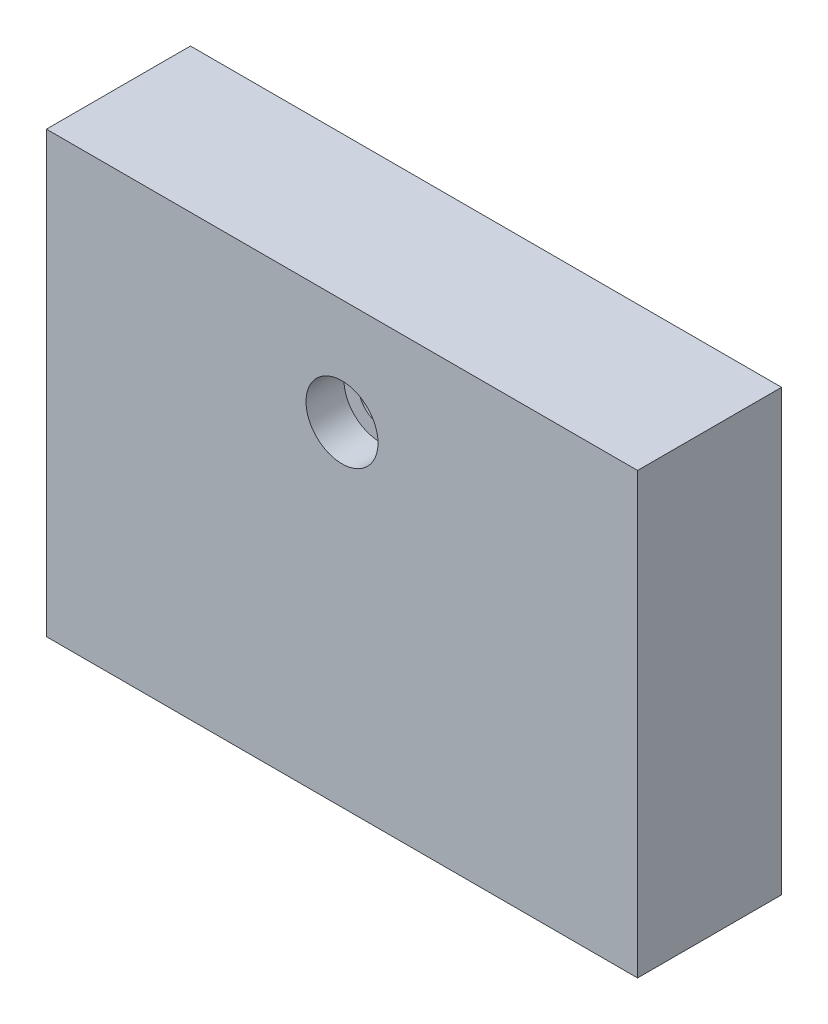
ISO-10303-21;
HEADER;
FILE_DESCRIPTION(('STEP AP214'),'2;1');
FILE_NAME('part.step','',(''),(''),'','','');
FILE_SCHEMA(('AUTOMOTIVE_DESIGN { 1 0 10303 214 1 1 1 1 }'));
ENDSEC;
DATA;
#1=APPLICATION_CONTEXT('core data for automotive mechanical design processes');
#2=APPLICATION_PROTOCOL_DEFINITION('international standard','automotive_design',2000,#1);
#3=PRODUCT_CONTEXT('',#1,'mechanical');
#4=PRODUCT('Part','Part','',(#3));
#5=PRODUCT_RELATED_PRODUCT_CATEGORY('part','',(#4));
#6=PRODUCT_DEFINITION_FORMATION('','',#4);
#7=PRODUCT_DEFINITION_CONTEXT('part definition',#1,'design');
#8=PRODUCT_DEFINITION('design','',#6,#7);
#9=PRODUCT_DEFINITION_SHAPE('','',#8);
#10=(LENGTH_UNIT() NAMED_UNIT(*) SI_UNIT(.MILLI.,.METRE.));
#11=(NAMED_UNIT(*) PLANE_ANGLE_UNIT() SI_UNIT($,.RADIAN.));
#12=(NAMED_UNIT(*) SI_UNIT($,.STERADIAN.) SOLID_ANGLE_UNIT());
#13=UNCERTAINTY_MEASURE_WITH_UNIT(LENGTH_MEASURE(1.E-05),#10,'distance_accuracy_value','');
#14=(GEOMETRIC_REPRESENTATION_CONTEXT(3) GLOBAL_UNCERTAINTY_ASSIGNED_CONTEXT((#13)) GLOBAL_UNIT_ASSIGNED_CONTEXT((#10,
#11,#12)) REPRESENTATION_CONTEXT('',''));
#15=CARTESIAN_POINT('',(0.,0.,0.));
#16=DIRECTION('',(0.,0.,1.));
#17=DIRECTION('',(1.,0.,0.));
#18=AXIS2_PLACEMENT_3D('',#15,#16,#17);
#19=CARTESIAN_POINT('',(0.,0.,19.));
#20=DIRECTION('',(1.,0.,0.));
#21=DIRECTION('',(0.,0.,-1.));
#22=AXIS2_PLACEMENT_3D('',#19,#20,#21);
#23=PLANE('',#22);
#24=DIRECTION('',(0.,-1.,0.));
#25=VECTOR('',#24,1.);
#26=CARTESIAN_POINT('',(0.,0.,0.));
#27=LINE('',#26,#25);
#28=CARTESIAN_POINT('',(0.,58.,0.));
#29=VERTEX_POINT('',#28);
#30=CARTESIAN_POINT('',(0.,0.,0.));
#31=VERTEX_POINT('',#30);
#32=EDGE_CURVE('E101',#29,#31,#27,.T.);
#33=ORIENTED_EDGE('',*,*,#32,.T.);
#34=DIRECTION('',(0.,0.,-1.));
#35=VECTOR('',#34,1.);
#36=CARTESIAN_POINT('',(0.,0.,19.));
#37=LINE('',#36,#35);
#38=CARTESIAN_POINT('',(0.,0.,19.));
#39=VERTEX_POINT('',#38);
#40=EDGE_CURVE('E11',#39,#31,#37,.T.);
#41=ORIENTED_EDGE('',*,*,#40,.F.);
#42=DIRECTION('',(0.,-1.,0.));
#43=VECTOR('',#42,1.);
#44=CARTESIAN_POINT('',(0.,0.,19.));
#45=LINE('',#44,#43);
#46=CARTESIAN_POINT('',(0.,58.,19.));
#47=VERTEX_POINT('',#46);
#48=EDGE_CURVE('E90',#47,#39,#45,.T.);
#49=ORIENTED_EDGE('',*,*,#48,.F.);
#50=DIRECTION('',(0.,0.,-1.));
#51=VECTOR('',#50,1.);
#52=CARTESIAN_POINT('',(0.,58.,19.));
#53=LINE('',#52,#51);
#54=EDGE_CURVE('E100',#47,#29,#53,.T.);
#55=ORIENTED_EDGE('',*,*,#54,.T.);
#56=EDGE_LOOP('',(#33,#41,#49,#55));
#57=FACE_BOUND('',#56,.T.);
#58=ADVANCED_FACE('F36',(#57),#23,.F.);
#59=CARTESIAN_POINT('',(0.,0.,19.));
#60=DIRECTION('',(0.,1.,0.));
#61=DIRECTION('',(0.,0.,1.));
#62=AXIS2_PLACEMENT_3D('',#59,#60,#61);
#63=PLANE('',#62);
#64=DIRECTION('',(1.,0.,0.));
#65=VECTOR('',#64,1.);
#66=CARTESIAN_POINT('',(0.,0.,0.));
#67=LINE('',#66,#65);
#68=CARTESIAN_POINT('',(78.,0.,0.));
#69=VERTEX_POINT('',#68);
#70=EDGE_CURVE('E91',#31,#69,#67,.T.);
#71=ORIENTED_EDGE('',*,*,#70,.T.);
#72=DIRECTION('',(0.,0.,-1.));
#73=VECTOR('',#72,1.);
#74=CARTESIAN_POINT('',(78.,0.,19.));
#75=LINE('',#74,#73);
#76=CARTESIAN_POINT('',(78.,0.,19.));
#77=VERTEX_POINT('',#76);
#78=EDGE_CURVE('E46',#77,#69,#75,.T.);
#79=ORIENTED_EDGE('',*,*,#78,.F.);
#80=DIRECTION('',(1.,0.,0.));
#81=VECTOR('',#80,1.);
#82=CARTESIAN_POINT('',(0.,0.,19.));
#83=LINE('',#82,#81);
#84=EDGE_CURVE('E81',#39,#77,#83,.T.);
#85=ORIENTED_EDGE('',*,*,#84,.F.);
#86=ORIENTED_EDGE('',*,*,#40,.T.);
#87=EDGE_LOOP('',(#71,#79,#85,#86));
#88=FACE_BOUND('',#87,.T.);
#89=ADVANCED_FACE('F95',(#88),#63,.F.);
#90=CARTESIAN_POINT('',(78.,0.,19.));
#91=DIRECTION('',(-1.,0.,0.));
#92=DIRECTION('',(0.,0.,1.));
#93=AXIS2_PLACEMENT_3D('',#90,#91,#92);
#94=PLANE('',#93);
#95=DIRECTION('',(0.,1.,0.));
#96=VECTOR('',#95,1.);
#97=CARTESIAN_POINT('',(78.,0.,0.));
#98=LINE('',#97,#96);
#99=CARTESIAN_POINT('',(78.,58.,0.));
#100=VERTEX_POINT('',#99);
#101=EDGE_CURVE('E72',#69,#100,#98,.T.);
#102=ORIENTED_EDGE('',*,*,#101,.T.);
#103=DIRECTION('',(0.,0.,-1.));
#104=VECTOR('',#103,1.);
#105=CARTESIAN_POINT('',(78.,58.,19.));
#106=LINE('',#105,#104);
#107=CARTESIAN_POINT('',(78.,58.,19.));
#108=VERTEX_POINT('',#107);
#109=EDGE_CURVE('E94',#108,#100,#106,.T.);
#110=ORIENTED_EDGE('',*,*,#109,.F.);
#111=DIRECTION('',(0.,1.,0.));
#112=VECTOR('',#111,1.);
#113=CARTESIAN_POINT('',(78.,0.,19.));
#114=LINE('',#113,#112);
#115=EDGE_CURVE('E87',#77,#108,#114,.T.);
#116=ORIENTED_EDGE('',*,*,#115,.F.);
#117=ORIENTED_EDGE('',*,*,#78,.T.);
#118=EDGE_LOOP('',(#102,#110,#116,#117));
#119=FACE_BOUND('',#118,.T.);
#120=ADVANCED_FACE('F92',(#119),#94,.F.);
#121=CARTESIAN_POINT('',(0.,58.,19.));
#122=DIRECTION('',(0.,-1.,0.));
#123=DIRECTION('',(0.,0.,-1.));
#124=AXIS2_PLACEMENT_3D('',#121,#122,#123);
#125=PLANE('',#124);
#126=DIRECTION('',(-1.,0.,0.));
#127=VECTOR('',#126,1.);
#128=CARTESIAN_POINT('',(0.,58.,0.));
#129=LINE('',#128,#127);
#130=EDGE_CURVE('E76',#100,#29,#129,.T.);
#131=ORIENTED_EDGE('',*,*,#130,.T.);
#132=ORIENTED_EDGE('',*,*,#54,.F.);
#133=DIRECTION('',(-1.,0.,0.));
#134=VECTOR('',#133,1.);
#135=CARTESIAN_POINT('',(0.,58.,19.));
#136=LINE('',#135,#134);
#137=EDGE_CURVE('E53',#108,#47,#136,.T.);
#138=ORIENTED_EDGE('',*,*,#137,.F.);
#139=ORIENTED_EDGE('',*,*,#109,.T.);
#140=EDGE_LOOP('',(#131,#132,#138,#139));
#141=FACE_BOUND('',#140,.T.);
#142=ADVANCED_FACE('F108',(#141),#125,.F.);
#143=CARTESIAN_POINT('',(0.,0.,19.));
#144=DIRECTION('',(0.,0.,-1.));
#145=DIRECTION('',(-1.,0.,0.));
#146=AXIS2_PLACEMENT_3D('',#143,#144,#145);
#147=PLANE('',#146);
#148=CARTESIAN_POINT('',(39.,44.,19.));
#149=DIRECTION('',(0.,0.,1.));
#150=DIRECTION('',(1.,0.,0.));
#151=AXIS2_PLACEMENT_3D('',#148,#149,#150);
#152=CIRCLE('',#151,4.75);
#153=CARTESIAN_POINT('',(43.75,44.,19.));
#154=VERTEX_POINT('',#153);
#155=EDGE_CURVE('E113',#154,#154,#152,.T.);
#156=ORIENTED_EDGE('',*,*,#155,.F.);
#157=EDGE_LOOP('',(#156));
#158=FACE_BOUND('',#157,.T.);
#159=ORIENTED_EDGE('',*,*,#48,.T.);
#160=ORIENTED_EDGE('',*,*,#84,.T.);
#161=ORIENTED_EDGE('',*,*,#115,.T.);
#162=ORIENTED_EDGE('',*,*,#137,.T.);
#163=EDGE_LOOP('',(#159,#160,#161,#162));
#164=FACE_BOUND('',#163,.T.);
#165=ADVANCED_FACE('F83',(#158,#164),#147,.F.);
#166=CARTESIAN_POINT('',(0.,0.,0.));
#167=DIRECTION('',(0.,0.,-1.));
#168=DIRECTION('',(-1.,0.,0.));
#169=AXIS2_PLACEMENT_3D('',#166,#167,#168);
#170=PLANE('',#169);
#171=CARTESIAN_POINT('',(39.,44.,0.));
#172=DIRECTION('',(0.,0.,1.));
#173=DIRECTION('',(1.,0.,0.));
#174=AXIS2_PLACEMENT_3D('',#171,#172,#173);
#175=CIRCLE('',#174,2.75);
#176=CARTESIAN_POINT('',(41.75,44.,0.));
#177=VERTEX_POINT('',#176);
#178=EDGE_CURVE('E120',#177,#177,#175,.T.);
#179=ORIENTED_EDGE('',*,*,#178,.T.);
#180=EDGE_LOOP('',(#179));
#181=FACE_BOUND('',#180,.T.);
#182=ORIENTED_EDGE('',*,*,#32,.F.);
#183=ORIENTED_EDGE('',*,*,#130,.F.);
#184=ORIENTED_EDGE('',*,*,#101,.F.);
#185=ORIENTED_EDGE('',*,*,#70,.F.);
#186=EDGE_LOOP('',(#182,#183,#184,#185));
#187=FACE_BOUND('',#186,.T.);
#188=ADVANCED_FACE('F115',(#181,#187),#170,.T.);
#189=CARTESIAN_POINT('',(39.,44.,14.));
#190=DIRECTION('',(0.,0.,1.));
#191=DIRECTION('',(1.,0.,0.));
#192=AXIS2_PLACEMENT_3D('',#189,#190,#191);
#193=CYLINDRICAL_SURFACE('',#192,4.75);
#194=CARTESIAN_POINT('',(39.,44.,14.));
#195=DIRECTION('',(0.,0.,1.));
#196=DIRECTION('',(1.,0.,0.));
#197=AXIS2_PLACEMENT_3D('',#194,#195,#196);
#198=CIRCLE('',#197,4.75);
#199=CARTESIAN_POINT('',(43.75,44.,14.));
#200=VERTEX_POINT('',#199);
#201=EDGE_CURVE('E102',#200,#200,#198,.T.);
#202=ORIENTED_EDGE('',*,*,#201,.F.);
#203=EDGE_LOOP('',(#202));
#204=FACE_BOUND('',#203,.T.);
#205=ORIENTED_EDGE('',*,*,#155,.T.);
#206=EDGE_LOOP('',(#205));
#207=FACE_BOUND('',#206,.T.);
#208=ADVANCED_FACE('F140',(#204,#207),#193,.F.);
#209=CARTESIAN_POINT('',(39.,44.,14.));
#210=DIRECTION('',(0.,0.,1.));
#211=DIRECTION('',(1.,0.,0.));
#212=AXIS2_PLACEMENT_3D('',#209,#210,#211);
#213=PLANE('',#212);
#214=CARTESIAN_POINT('',(39.,44.,14.));
#215=DIRECTION('',(0.,0.,1.));
#216=DIRECTION('',(1.,0.,0.));
#217=AXIS2_PLACEMENT_3D('',#214,#215,#216);
#218=CIRCLE('',#217,2.75);
#219=CARTESIAN_POINT('',(41.75,44.,14.));
#220=VERTEX_POINT('',#219);
#221=EDGE_CURVE('E122',#220,#220,#218,.T.);
#222=ORIENTED_EDGE('',*,*,#221,.F.);
#223=EDGE_LOOP('',(#222));
#224=FACE_BOUND('',#223,.T.);
#225=ORIENTED_EDGE('',*,*,#201,.T.);
#226=EDGE_LOOP('',(#225));
#227=FACE_BOUND('',#226,.T.);
#228=ADVANCED_FACE('F134',(#224,#227),#213,.T.);
#229=CARTESIAN_POINT('',(39.,44.,0.));
#230=DIRECTION('',(0.,0.,1.));
#231=DIRECTION('',(1.,0.,0.));
#232=AXIS2_PLACEMENT_3D('',#229,#230,#231);
#233=CYLINDRICAL_SURFACE('',#232,2.75);
#234=CARTESIAN_POINT('',(41.75,44.,0.));
#235=CARTESIAN_POINT('',(41.75,44.,0.145833333333333));
#236=CARTESIAN_POINT('',(41.75,44.,0.291666666666667));
#237=CARTESIAN_POINT('',(41.75,44.,0.583333333333333));
#238=CARTESIAN_POINT('',(41.75,44.,0.729166666666667));
#239=CARTESIAN_POINT('',(41.75,44.,1.02083333333333));
#240=CARTESIAN_POINT('',(41.75,44.,1.16666666666667));
#241=CARTESIAN_POINT('',(41.75,44.,1.45833333333333));
#242=CARTESIAN_POINT('',(41.75,44.,1.60416666666667));
#243=CARTESIAN_POINT('',(41.75,44.,1.89583333333333));
#244=CARTESIAN_POINT('',(41.75,44.,2.04166666666667));
#245=CARTESIAN_POINT('',(41.75,44.,2.33333333333333));
#246=CARTESIAN_POINT('',(41.75,44.,2.47916666666667));
#247=CARTESIAN_POINT('',(41.75,44.,2.77083333333333));
#248=CARTESIAN_POINT('',(41.75,44.,2.91666666666667));
#249=CARTESIAN_POINT('',(41.75,44.,3.20833333333333));
#250=CARTESIAN_POINT('',(41.75,44.,3.35416666666667));
#251=CARTESIAN_POINT('',(41.75,44.,3.64583333333333));
#252=CARTESIAN_POINT('',(41.75,44.,3.79166666666667));
#253=CARTESIAN_POINT('',(41.75,44.,4.08333333333333));
#254=CARTESIAN_POINT('',(41.75,44.,4.22916666666667));
#255=CARTESIAN_POINT('',(41.75,44.,4.52083333333333));
#256=CARTESIAN_POINT('',(41.75,44.,4.66666666666667));
#257=CARTESIAN_POINT('',(41.75,44.,4.95833333333333));
#258=CARTESIAN_POINT('',(41.75,44.,5.10416666666667));
#259=CARTESIAN_POINT('',(41.75,44.,5.39583333333333));
#260=CARTESIAN_POINT('',(41.75,44.,5.54166666666667));
#261=CARTESIAN_POINT('',(41.75,44.,5.83333333333333));
#262=CARTESIAN_POINT('',(41.75,44.,5.97916666666667));
#263=CARTESIAN_POINT('',(41.75,44.,6.27083333333333));
#264=CARTESIAN_POINT('',(41.75,44.,6.41666666666667));
#265=CARTESIAN_POINT('',(41.75,44.,6.70833333333333));
#266=CARTESIAN_POINT('',(41.75,44.,6.85416666666666));
#267=CARTESIAN_POINT('',(41.75,44.,7.14583333333333));
#268=CARTESIAN_POINT('',(41.75,44.,7.29166666666667));
#269=CARTESIAN_POINT('',(41.75,44.,7.58333333333333));
#270=CARTESIAN_POINT('',(41.75,44.,7.72916666666667));
#271=CARTESIAN_POINT('',(41.75,44.,8.02083333333333));
#272=CARTESIAN_POINT('',(41.75,44.,8.16666666666666));
#273=CARTESIAN_POINT('',(41.75,44.,8.45833333333333));
#274=CARTESIAN_POINT('',(41.75,44.,8.60416666666666));
#275=CARTESIAN_POINT('',(41.75,44.,8.89583333333333));
#276=CARTESIAN_POINT('',(41.75,44.,9.04166666666666));
#277=CARTESIAN_POINT('',(41.75,44.,9.33333333333333));
#278=CARTESIAN_POINT('',(41.75,44.,9.47916666666666));
#279=CARTESIAN_POINT('',(41.75,44.,9.77083333333333));
#280=CARTESIAN_POINT('',(41.75,44.,9.91666666666666));
#281=CARTESIAN_POINT('',(41.75,44.,10.2083333333333));
#282=CARTESIAN_POINT('',(41.75,44.,10.3541666666667));
#283=CARTESIAN_POINT('',(41.75,44.,10.6458333333333));
#284=CARTESIAN_POINT('',(41.75,44.,10.7916666666667));
#285=CARTESIAN_POINT('',(41.75,44.,11.0833333333333));
#286=CARTESIAN_POINT('',(41.75,44.,11.2291666666667));
#287=CARTESIAN_POINT('',(41.75,44.,11.5208333333333));
#288=CARTESIAN_POINT('',(41.75,44.,11.6666666666667));
#289=CARTESIAN_POINT('',(41.75,44.,11.9583333333333));
#290=CARTESIAN_POINT('',(41.75,44.,12.1041666666667));
#291=CARTESIAN_POINT('',(41.75,44.,12.3958333333333));
#292=CARTESIAN_POINT('',(41.75,44.,12.5416666666667));
#293=CARTESIAN_POINT('',(41.75,44.,12.8333333333333));
#294=CARTESIAN_POINT('',(41.75,44.,12.9791666666667));
#295=CARTESIAN_POINT('',(41.75,44.,13.2708333333333));
#296=CARTESIAN_POINT('',(41.75,44.,13.4166666666667));
#297=CARTESIAN_POINT('',(41.75,44.,13.7083333333333));
#298=CARTESIAN_POINT('',(41.75,44.,13.8541666666667));
#299=CARTESIAN_POINT('',(41.75,44.,14.));
#300=B_SPLINE_CURVE_WITH_KNOTS('',3,(#234,#235,#236,#237,#238,#239,#240,#241,#242,#243,#244,
#245,#246,#247,#248,#249,#250,#251,#252,#253,#254,#255,#256,#257,#258,#259,#260,#261,#262,#263,
#264,#265,#266,#267,#268,#269,#270,#271,#272,#273,#274,#275,#276,#277,#278,#279,#280,#281,#282,
#283,#284,#285,#286,#287,#288,#289,#290,#291,#292,#293,#294,#295,#296,#297,#298,#299),
.UNSPECIFIED.,.F.,.F.,(4,2,2,2,2,2,2,2,2,2,2,2,2,2,2,2,2,2,2,2,2,2,2,2,2,2,2,2,2,2,2,2,4),(0.,
0.4375,0.875,1.3125,1.75,2.1875,2.625,3.0625,3.5,3.9375,4.375,4.8125,5.25,5.6875,6.125,6.5625,
7.,7.4375,7.875,8.3125,8.75,9.1875,9.625,10.0625,10.5,10.9375,11.375,11.8125,12.25,12.6875,
13.125,13.5625,14.),.UNSPECIFIED.);
#301=EDGE_CURVE('BSEAM126',#177,#220,#300,.T.);
#302=ORIENTED_EDGE('',*,*,#178,.F.);
#303=ORIENTED_EDGE('',*,*,#221,.T.);
#304=ORIENTED_EDGE('',*,*,#301,.T.);
#305=ORIENTED_EDGE('',*,*,#301,.F.);
#306=EDGE_LOOP('',(#302,#304,#303,#305));
#307=FACE_BOUND('',#306,.T.);
#308=ADVANCED_FACE('F126',(#307),#233,.F.);
#309=CLOSED_SHELL('',(#58,#89,#120,#142,#165,#188,#208,#228,#308));
#310=MANIFOLD_SOLID_BREP('B2',#309);
#311=ADVANCED_BREP_SHAPE_REPRESENTATION('',(#18,#310),#14);
#312=SHAPE_DEFINITION_REPRESENTATION(#9,#311);
ENDSEC;
END-ISO-10303-21;
